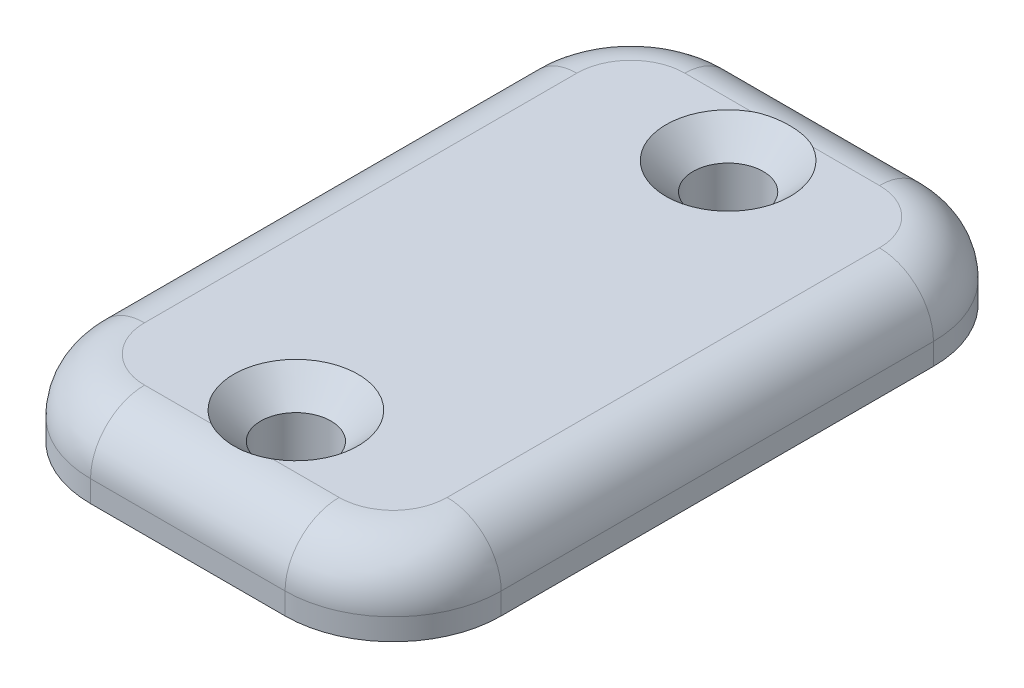
ISO-10303-21;
HEADER;
FILE_DESCRIPTION(('STEP AP214'),'2;1');
FILE_NAME('part.step','',(''),(''),'','','');
FILE_SCHEMA(('AUTOMOTIVE_DESIGN { 1 0 10303 214 1 1 1 1 }'));
ENDSEC;
DATA;
#1=APPLICATION_CONTEXT('core data for automotive mechanical design processes');
#2=APPLICATION_PROTOCOL_DEFINITION('international standard','automotive_design',2000,#1);
#3=PRODUCT_CONTEXT('',#1,'mechanical');
#4=PRODUCT('Part','Part','',(#3));
#5=PRODUCT_RELATED_PRODUCT_CATEGORY('part','',(#4));
#6=PRODUCT_DEFINITION_FORMATION('','',#4);
#7=PRODUCT_DEFINITION_CONTEXT('part definition',#1,'design');
#8=PRODUCT_DEFINITION('design','',#6,#7);
#9=PRODUCT_DEFINITION_SHAPE('','',#8);
#10=(LENGTH_UNIT() NAMED_UNIT(*) SI_UNIT(.MILLI.,.METRE.));
#11=(NAMED_UNIT(*) PLANE_ANGLE_UNIT() SI_UNIT($,.RADIAN.));
#12=(NAMED_UNIT(*) SI_UNIT($,.STERADIAN.) SOLID_ANGLE_UNIT());
#13=UNCERTAINTY_MEASURE_WITH_UNIT(LENGTH_MEASURE(1.E-05),#10,'distance_accuracy_value','');
#14=(GEOMETRIC_REPRESENTATION_CONTEXT(3) GLOBAL_UNCERTAINTY_ASSIGNED_CONTEXT((#13)) GLOBAL_UNIT_ASSIGNED_CONTEXT((#10,
#11,#12)) REPRESENTATION_CONTEXT('',''));
#15=CARTESIAN_POINT('',(0.,0.,0.));
#16=DIRECTION('',(0.,0.,1.));
#17=DIRECTION('',(1.,0.,0.));
#18=AXIS2_PLACEMENT_3D('',#15,#16,#17);
#19=CARTESIAN_POINT('',(0.,32.2,60.));
#20=DIRECTION('',(0.,1.,0.));
#21=DIRECTION('',(0.,0.,1.));
#22=AXIS2_PLACEMENT_3D('',#19,#20,#21);
#23=PLANE('',#22);
#24=CARTESIAN_POINT('',(-8.99999999999999,32.2,50.));
#25=DIRECTION('',(0.,1.,0.));
#26=DIRECTION('',(0.,0.,1.));
#27=AXIS2_PLACEMENT_3D('',#24,#25,#26);
#28=CIRCLE('',#27,5.);
#29=CARTESIAN_POINT('',(-8.99999999999999,32.2,55.));
#30=VERTEX_POINT('',#29);
#31=CARTESIAN_POINT('',(-14.,32.2,50.));
#32=VERTEX_POINT('',#31);
#33=EDGE_CURVE('E157',#30,#32,#28,.F.);
#34=ORIENTED_EDGE('',*,*,#33,.F.);
#35=DIRECTION('',(1.,0.,0.));
#36=VECTOR('',#35,1.);
#37=CARTESIAN_POINT('',(0.,32.2,55.));
#38=LINE('',#37,#36);
#39=CARTESIAN_POINT('',(-2.83945417290024,32.2,55.));
#40=VERTEX_POINT('',#39);
#41=EDGE_CURVE('E150',#30,#40,#38,.T.);
#42=ORIENTED_EDGE('',*,*,#41,.T.);
#43=CARTESIAN_POINT('',(0.,32.2,50.));
#44=DIRECTION('',(0.,1.,0.));
#45=DIRECTION('',(0.,0.,1.));
#46=AXIS2_PLACEMENT_3D('',#43,#44,#45);
#47=CIRCLE('',#46,5.75000000000005);
#48=CARTESIAN_POINT('',(2.83945417290024,32.2,55.));
#49=VERTEX_POINT('',#48);
#50=EDGE_CURVE('E152',#40,#49,#47,.F.);
#51=ORIENTED_EDGE('',*,*,#50,.T.);
#52=DIRECTION('',(1.,0.,0.));
#53=VECTOR('',#52,1.);
#54=CARTESIAN_POINT('',(0.,32.2,55.));
#55=LINE('',#54,#53);
#56=CARTESIAN_POINT('',(9.,32.2,55.));
#57=VERTEX_POINT('',#56);
#58=EDGE_CURVE('E164',#49,#57,#55,.T.);
#59=ORIENTED_EDGE('',*,*,#58,.T.);
#60=CARTESIAN_POINT('',(9.,32.2,50.));
#61=DIRECTION('',(0.,1.,0.));
#62=DIRECTION('',(0.,0.,1.));
#63=AXIS2_PLACEMENT_3D('',#60,#61,#62);
#64=CIRCLE('',#63,5.);
#65=CARTESIAN_POINT('',(14.,32.2,50.));
#66=VERTEX_POINT('',#65);
#67=EDGE_CURVE('E241',#66,#57,#64,.F.);
#68=ORIENTED_EDGE('',*,*,#67,.F.);
#69=DIRECTION('',(0.,0.,-1.));
#70=VECTOR('',#69,1.);
#71=CARTESIAN_POINT('',(14.,32.2,0.));
#72=LINE('',#71,#70);
#73=CARTESIAN_POINT('',(14.,32.2,10.));
#74=VERTEX_POINT('',#73);
#75=EDGE_CURVE('E187',#66,#74,#72,.T.);
#76=ORIENTED_EDGE('',*,*,#75,.T.);
#77=CARTESIAN_POINT('',(9.,32.2,10.));
#78=DIRECTION('',(0.,1.,0.));
#79=DIRECTION('',(0.,0.,1.));
#80=AXIS2_PLACEMENT_3D('',#77,#78,#79);
#81=CIRCLE('',#80,5.);
#82=CARTESIAN_POINT('',(9.,32.2,5.));
#83=VERTEX_POINT('',#82);
#84=EDGE_CURVE('E242',#83,#74,#81,.F.);
#85=ORIENTED_EDGE('',*,*,#84,.F.);
#86=DIRECTION('',(1.,0.,0.));
#87=VECTOR('',#86,1.);
#88=CARTESIAN_POINT('',(-19.,32.2,5.));
#89=LINE('',#88,#87);
#90=CARTESIAN_POINT('',(2.8394541729003,32.2,5.));
#91=VERTEX_POINT('',#90);
#92=EDGE_CURVE('E156',#83,#91,#89,.F.);
#93=ORIENTED_EDGE('',*,*,#92,.T.);
#94=CARTESIAN_POINT('',(0.,32.2,9.99999999999999));
#95=DIRECTION('',(0.,1.,0.));
#96=DIRECTION('',(0.,0.,1.));
#97=AXIS2_PLACEMENT_3D('',#94,#95,#96);
#98=CIRCLE('',#97,5.75000000000007);
#99=CARTESIAN_POINT('',(-2.8394541729003,32.2,5.));
#100=VERTEX_POINT('',#99);
#101=EDGE_CURVE('E175',#91,#100,#98,.F.);
#102=ORIENTED_EDGE('',*,*,#101,.T.);
#103=DIRECTION('',(1.,0.,0.));
#104=VECTOR('',#103,1.);
#105=CARTESIAN_POINT('',(-19.,32.2,5.));
#106=LINE('',#105,#104);
#107=CARTESIAN_POINT('',(-8.99999999999999,32.2,5.));
#108=VERTEX_POINT('',#107);
#109=EDGE_CURVE('E158',#100,#108,#106,.F.);
#110=ORIENTED_EDGE('',*,*,#109,.T.);
#111=CARTESIAN_POINT('',(-8.99999999999999,32.2,10.));
#112=DIRECTION('',(0.,1.,0.));
#113=DIRECTION('',(0.,0.,1.));
#114=AXIS2_PLACEMENT_3D('',#111,#112,#113);
#115=CIRCLE('',#114,5.);
#116=CARTESIAN_POINT('',(-14.,32.2,10.));
#117=VERTEX_POINT('',#116);
#118=EDGE_CURVE('E250',#117,#108,#115,.F.);
#119=ORIENTED_EDGE('',*,*,#118,.F.);
#120=DIRECTION('',(0.,0.,-1.));
#121=VECTOR('',#120,1.);
#122=CARTESIAN_POINT('',(-14.,32.2,60.));
#123=LINE('',#122,#121);
#124=EDGE_CURVE('E174',#117,#32,#123,.F.);
#125=ORIENTED_EDGE('',*,*,#124,.T.);
#126=EDGE_LOOP('',(#34,#42,#51,#59,#68,#76,#85,#93,#102,#110,#119,#125));
#127=FACE_BOUND('',#126,.T.);
#128=ADVANCED_FACE('F44',(#127),#23,.T.);
#129=CARTESIAN_POINT('',(0.,29.6999999999999,9.99999999999999));
#130=DIRECTION('',(0.,1.,0.));
#131=DIRECTION('',(0.,0.,1.));
#132=AXIS2_PLACEMENT_3D('',#129,#130,#131);
#133=CONICAL_SURFACE('',#132,3.25,0.78539816339745);
#134=ORIENTED_EDGE('',*,*,#101,.F.);
#135=CARTESIAN_POINT('',(2.8394541729003,32.2,5.));
#136=CARTESIAN_POINT('',(2.77701180748167,32.1999967904525,4.96454306186633));
#137=CARTESIAN_POINT('',(2.71373734153912,32.199623182009,4.93058687727614));
#138=CARTESIAN_POINT('',(2.5857312783847,32.1982995553661,4.86559718841058));
#139=CARTESIAN_POINT('',(2.52100009169975,32.1973496976519,4.83456287317575));
#140=CARTESIAN_POINT('',(2.32506969512298,32.1938851873325,4.74578266282135));
#141=CARTESIAN_POINT('',(2.19195042263589,32.1907546285525,4.69225661805047));
#142=CARTESIAN_POINT('',(1.92273144178334,32.1838988726502,4.59620443111456));
#143=CARTESIAN_POINT('',(1.78665337530315,32.1801772126099,4.55361657202852));
#144=CARTESIAN_POINT('',(1.51168559547504,32.1728773065376,4.47854782318284));
#145=CARTESIAN_POINT('',(1.37279478485586,32.1692991181624,4.44607096195946));
#146=CARTESIAN_POINT('',(1.08771237446433,32.1627147179003,4.38984041579236));
#147=CARTESIAN_POINT('',(0.941445042299288,32.1597356995484,4.36646897233116));
#148=CARTESIAN_POINT('',(0.647613833704594,32.1549410782678,4.33000335570781));
#149=CARTESIAN_POINT('',(0.500049874684837,32.1531255500016,4.31690984207926));
#150=CARTESIAN_POINT('',(0.203776272793809,32.1508806955571,4.30082379596564));
#151=CARTESIAN_POINT('',(0.0550644070275619,32.150456885622,4.29787145712705));
#152=CARTESIAN_POINT('',(-0.242215005936862,32.151060759135,4.30214699650085));
#153=CARTESIAN_POINT('',(-0.390782542221276,32.1520885449169,4.30937559244355));
#154=CARTESIAN_POINT('',(-0.717900880967203,32.1558281196479,4.33666748261943));
#155=CARTESIAN_POINT('',(-0.896257482571835,32.1588458372464,4.35908861127944));
#156=CARTESIAN_POINT('',(-1.25043701333155,32.1662564059591,4.4192954615815));
#157=CARTESIAN_POINT('',(-1.42625864428835,32.1706499371914,4.45708878506348));
#158=CARTESIAN_POINT('',(-1.77286026127886,32.1797803822724,4.54845836980744));
#159=CARTESIAN_POINT('',(-1.94366035622819,32.1845155512584,4.6019581948921));
#160=CARTESIAN_POINT('',(-2.27900387951099,32.1928557866749,4.72568687593271));
#161=CARTESIAN_POINT('',(-2.44355536329236,32.1964623547406,4.79589328233448));
#162=CARTESIAN_POINT('',(-2.64352579762328,32.1989294159071,4.89471398219272));
#163=CARTESIAN_POINT('',(-2.6831370167109,32.1993202222608,4.91497879807455));
#164=CARTESIAN_POINT('',(-2.76175686875064,32.1998556133103,4.95663655904585));
#165=CARTESIAN_POINT('',(-2.80076557570586,32.2000002284864,4.97802936414313));
#166=CARTESIAN_POINT('',(-2.8394541729003,32.2,5.));
#167=B_SPLINE_CURVE_WITH_KNOTS('',3,(#135,#136,#137,#138,#139,#140,#141,#142,#143,#144,#145,
#146,#147,#148,#149,#150,#151,#152,#153,#154,#155,#156,#157,#158,#159,#160,#161,#162,#163,#164,
#165,#166),.UNSPECIFIED.,.F.,.F.,(4,2,2,2,2,2,2,2,2,2,2,2,2,2,2,4),(0.,0.215370011368553,
0.430680069876265,0.860672050618723,1.28818175499743,1.71586157520339,2.15994075109805,
2.60404842117403,3.04991425426598,3.49581152135144,4.03449876041674,4.57345271497647,
5.10982612256911,5.6454828056678,5.77895636905964,5.91241340616258),.UNSPECIFIED.);
#168=EDGE_CURVE('E223',#91,#100,#167,.T.);
#169=ORIENTED_EDGE('',*,*,#168,.T.);
#170=EDGE_LOOP('',(#134,#169));
#171=FACE_BOUND('',#170,.T.);
#172=CARTESIAN_POINT('',(0.,29.6999999999999,9.99999999999999));
#173=DIRECTION('',(0.,1.,0.));
#174=DIRECTION('',(0.,0.,1.));
#175=AXIS2_PLACEMENT_3D('',#172,#173,#174);
#176=CIRCLE('',#175,3.25);
#177=CARTESIAN_POINT('',(0.,29.6999999999999,13.25));
#178=VERTEX_POINT('',#177);
#179=EDGE_CURVE('E171',#178,#178,#176,.T.);
#180=ORIENTED_EDGE('',*,*,#179,.F.);
#181=EDGE_LOOP('',(#180));
#182=FACE_BOUND('',#181,.T.);
#183=ADVANCED_FACE('F210',(#171,#182),#133,.F.);
#184=CARTESIAN_POINT('',(0.,29.6999999999999,50.));
#185=DIRECTION('',(0.,1.,0.));
#186=DIRECTION('',(0.,0.,1.));
#187=AXIS2_PLACEMENT_3D('',#184,#185,#186);
#188=CONICAL_SURFACE('',#187,3.25,0.785398163397449);
#189=ORIENTED_EDGE('',*,*,#50,.F.);
#190=CARTESIAN_POINT('',(-2.83945417290024,32.2,55.));
#191=CARTESIAN_POINT('',(-2.77701180748161,32.1999967904525,55.0354569381337));
#192=CARTESIAN_POINT('',(-2.71373734153906,32.199623182009,55.0694131227239));
#193=CARTESIAN_POINT('',(-2.58573127838464,32.1982995553661,55.1344028115894));
#194=CARTESIAN_POINT('',(-2.52100009169968,32.1973496976519,55.1654371268243));
#195=CARTESIAN_POINT('',(-2.32506969512292,32.1938851873325,55.2542173371786));
#196=CARTESIAN_POINT('',(-2.19195042263582,32.1907546285525,55.3077433819495));
#197=CARTESIAN_POINT('',(-1.92273144178327,32.1838988726502,55.4037955688854));
#198=CARTESIAN_POINT('',(-1.78665337530309,32.1801772126099,55.4463834279715));
#199=CARTESIAN_POINT('',(-1.51168559547498,32.1728773065376,55.5214521768171));
#200=CARTESIAN_POINT('',(-1.3727947848558,32.1692991181624,55.5539290380405));
#201=CARTESIAN_POINT('',(-1.08771237446427,32.1627147179003,55.6101595842076));
#202=CARTESIAN_POINT('',(-0.94144504229923,32.1597356995484,55.6335310276688));
#203=CARTESIAN_POINT('',(-0.647613833704536,32.1549410782678,55.6699966442922));
#204=CARTESIAN_POINT('',(-0.500049874684779,32.1531255500016,55.6830901579207));
#205=CARTESIAN_POINT('',(-0.203776272793751,32.1508806955571,55.6991762040343));
#206=CARTESIAN_POINT('',(-0.055064407027504,32.150456885622,55.7021285428729));
#207=CARTESIAN_POINT('',(0.242215005936919,32.151060759135,55.6978530034991));
#208=CARTESIAN_POINT('',(0.390782542221334,32.1520885449169,55.6906244075564));
#209=CARTESIAN_POINT('',(0.717900880967258,32.1558281196479,55.6633325173805));
#210=CARTESIAN_POINT('',(0.896257482571889,32.1588458372464,55.6409113887205));
#211=CARTESIAN_POINT('',(1.2504370133316,32.1662564059591,55.5807045384185));
#212=CARTESIAN_POINT('',(1.4262586442884,32.1706499371914,55.5429112149365));
#213=CARTESIAN_POINT('',(1.7728602612789,32.1797803822724,55.4515416301925));
#214=CARTESIAN_POINT('',(1.94366035622823,32.1845155512584,55.3980418051079));
#215=CARTESIAN_POINT('',(2.27900387951103,32.1928557866749,55.2743131240672));
#216=CARTESIAN_POINT('',(2.4435553632924,32.1964623547406,55.2041067176655));
#217=CARTESIAN_POINT('',(2.6435257976233,32.1989294159071,55.1052860178072));
#218=CARTESIAN_POINT('',(2.68313701671091,32.1993202222608,55.0850212019254));
#219=CARTESIAN_POINT('',(2.76175686875061,32.1998556133103,55.0433634409541));
#220=CARTESIAN_POINT('',(2.80076557570582,32.2000002284864,55.0219706358569));
#221=CARTESIAN_POINT('',(2.83945417290023,32.2,55.));
#222=B_SPLINE_CURVE_WITH_KNOTS('',3,(#190,#191,#192,#193,#194,#195,#196,#197,#198,#199,#200,
#201,#202,#203,#204,#205,#206,#207,#208,#209,#210,#211,#212,#213,#214,#215,#216,#217,#218,#219,
#220,#221),.UNSPECIFIED.,.F.,.F.,(4,2,2,2,2,2,2,2,2,2,2,2,2,2,2,4),(0.,0.215370011368553,
0.43068006987627,0.860672050618723,1.28818175499742,1.71586157520338,2.15994075109804,
2.60404842117402,3.04991425426597,3.49581152135143,4.03449876041673,4.57345271497646,
5.10982612256909,5.64548280566778,5.77895636905956,5.91241340616245),.UNSPECIFIED.);
#223=EDGE_CURVE('E162',#40,#49,#222,.T.);
#224=ORIENTED_EDGE('',*,*,#223,.T.);
#225=EDGE_LOOP('',(#189,#224));
#226=FACE_BOUND('',#225,.T.);
#227=CARTESIAN_POINT('',(0.,29.6999999999999,50.));
#228=DIRECTION('',(0.,1.,0.));
#229=DIRECTION('',(0.,0.,1.));
#230=AXIS2_PLACEMENT_3D('',#227,#228,#229);
#231=CIRCLE('',#230,3.25);
#232=CARTESIAN_POINT('',(0.,29.6999999999999,53.25));
#233=VERTEX_POINT('',#232);
#234=EDGE_CURVE('E178',#233,#233,#231,.T.);
#235=ORIENTED_EDGE('',*,*,#234,.F.);
#236=EDGE_LOOP('',(#235));
#237=FACE_BOUND('',#236,.T.);
#238=ADVANCED_FACE('F169',(#226,#237),#188,.F.);
#239=CARTESIAN_POINT('',(0.,-19.,9.99999999999999));
#240=DIRECTION('',(0.,1.,0.));
#241=DIRECTION('',(0.,0.,1.));
#242=AXIS2_PLACEMENT_3D('',#239,#240,#241);
#243=CYLINDRICAL_SURFACE('',#242,3.25);
#244=CARTESIAN_POINT('',(0.,25.2,9.99999999999999));
#245=DIRECTION('',(0.,-1.,0.));
#246=DIRECTION('',(1.,0.,0.));
#247=AXIS2_PLACEMENT_3D('',#244,#245,#246);
#248=CIRCLE('',#247,3.25);
#249=CARTESIAN_POINT('',(0.,25.2,13.25));
#250=VERTEX_POINT('',#249);
#251=EDGE_CURVE('E314',#250,#250,#248,.T.);
#252=CARTESIAN_POINT('',(0.,29.6999999999999,13.25));
#253=CARTESIAN_POINT('',(0.,29.6531249999999,13.25));
#254=CARTESIAN_POINT('',(0.,29.6062499999999,13.25));
#255=CARTESIAN_POINT('',(0.,29.5124999999999,13.25));
#256=CARTESIAN_POINT('',(0.,29.4656249999999,13.25));
#257=CARTESIAN_POINT('',(0.,29.3718749999999,13.25));
#258=CARTESIAN_POINT('',(0.,29.3249999999999,13.25));
#259=CARTESIAN_POINT('',(0.,29.2312499999999,13.25));
#260=CARTESIAN_POINT('',(0.,29.1843749999999,13.25));
#261=CARTESIAN_POINT('',(0.,29.0906249999999,13.25));
#262=CARTESIAN_POINT('',(0.,29.0437499999999,13.25));
#263=CARTESIAN_POINT('',(0.,28.9499999999999,13.25));
#264=CARTESIAN_POINT('',(0.,28.9031249999999,13.25));
#265=CARTESIAN_POINT('',(0.,28.8093749999999,13.25));
#266=CARTESIAN_POINT('',(0.,28.7624999999999,13.25));
#267=CARTESIAN_POINT('',(0.,28.6687499999999,13.25));
#268=CARTESIAN_POINT('',(0.,28.6218749999999,13.25));
#269=CARTESIAN_POINT('',(0.,28.5281249999999,13.25));
#270=CARTESIAN_POINT('',(0.,28.4812499999999,13.25));
#271=CARTESIAN_POINT('',(0.,28.3874999999999,13.25));
#272=CARTESIAN_POINT('',(0.,28.3406249999999,13.25));
#273=CARTESIAN_POINT('',(0.,28.246875,13.25));
#274=CARTESIAN_POINT('',(0.,28.1999999999999,13.25));
#275=CARTESIAN_POINT('',(0.,28.10625,13.25));
#276=CARTESIAN_POINT('',(0.,28.059375,13.25));
#277=CARTESIAN_POINT('',(0.,27.965625,13.25));
#278=CARTESIAN_POINT('',(0.,27.91875,13.25));
#279=CARTESIAN_POINT('',(0.,27.825,13.25));
#280=CARTESIAN_POINT('',(0.,27.778125,13.25));
#281=CARTESIAN_POINT('',(0.,27.684375,13.25));
#282=CARTESIAN_POINT('',(0.,27.6375,13.25));
#283=CARTESIAN_POINT('',(0.,27.54375,13.25));
#284=CARTESIAN_POINT('',(0.,27.496875,13.25));
#285=CARTESIAN_POINT('',(0.,27.403125,13.25));
#286=CARTESIAN_POINT('',(0.,27.35625,13.25));
#287=CARTESIAN_POINT('',(0.,27.2625,13.25));
#288=CARTESIAN_POINT('',(0.,27.215625,13.25));
#289=CARTESIAN_POINT('',(0.,27.121875,13.25));
#290=CARTESIAN_POINT('',(0.,27.075,13.25));
#291=CARTESIAN_POINT('',(0.,26.98125,13.25));
#292=CARTESIAN_POINT('',(0.,26.934375,13.25));
#293=CARTESIAN_POINT('',(0.,26.840625,13.25));
#294=CARTESIAN_POINT('',(0.,26.79375,13.25));
#295=CARTESIAN_POINT('',(0.,26.7,13.25));
#296=CARTESIAN_POINT('',(0.,26.653125,13.25));
#297=CARTESIAN_POINT('',(0.,26.559375,13.25));
#298=CARTESIAN_POINT('',(0.,26.5125,13.25));
#299=CARTESIAN_POINT('',(0.,26.41875,13.25));
#300=CARTESIAN_POINT('',(0.,26.371875,13.25));
#301=CARTESIAN_POINT('',(0.,26.278125,13.25));
#302=CARTESIAN_POINT('',(0.,26.23125,13.25));
#303=CARTESIAN_POINT('',(0.,26.1375,13.25));
#304=CARTESIAN_POINT('',(0.,26.090625,13.25));
#305=CARTESIAN_POINT('',(0.,25.996875,13.25));
#306=CARTESIAN_POINT('',(0.,25.95,13.25));
#307=CARTESIAN_POINT('',(0.,25.85625,13.25));
#308=CARTESIAN_POINT('',(0.,25.809375,13.25));
#309=CARTESIAN_POINT('',(0.,25.715625,13.25));
#310=CARTESIAN_POINT('',(0.,25.66875,13.25));
#311=CARTESIAN_POINT('',(0.,25.575,13.25));
#312=CARTESIAN_POINT('',(0.,25.528125,13.25));
#313=CARTESIAN_POINT('',(0.,25.434375,13.25));
#314=CARTESIAN_POINT('',(0.,25.3875,13.25));
#315=CARTESIAN_POINT('',(0.,25.29375,13.25));
#316=CARTESIAN_POINT('',(0.,25.246875,13.25));
#317=CARTESIAN_POINT('',(0.,25.2,13.25));
#318=B_SPLINE_CURVE_WITH_KNOTS('',3,(#252,#253,#254,#255,#256,#257,#258,#259,#260,#261,#262,
#263,#264,#265,#266,#267,#268,#269,#270,#271,#272,#273,#274,#275,#276,#277,#278,#279,#280,#281,
#282,#283,#284,#285,#286,#287,#288,#289,#290,#291,#292,#293,#294,#295,#296,#297,#298,#299,#300,
#301,#302,#303,#304,#305,#306,#307,#308,#309,#310,#311,#312,#313,#314,#315,#316,#317),
.UNSPECIFIED.,.F.,.F.,(4,2,2,2,2,2,2,2,2,2,2,2,2,2,2,2,2,2,2,2,2,2,2,2,2,2,2,2,2,2,2,2,4),(0.,
0.140624999999998,0.281249999999997,0.421874999999995,0.562499999999994,0.703124999999985,
0.843749999999983,0.984374999999982,1.12499999999998,1.26562499999998,1.40624999999998,
1.54687499999998,1.68749999999997,1.82812499999997,1.96874999999996,2.10937499999996,
2.24999999999996,2.39062499999996,2.53124999999996,2.67187499999996,2.81249999999995,
2.95312499999995,3.09374999999994,3.23437499999994,3.37499999999994,3.51562499999994,
3.65624999999994,3.79687499999994,3.93749999999993,4.07812499999993,4.21874999999992,
4.35937499999992,4.49999999999992),.UNSPECIFIED.);
#319=EDGE_CURVE('BSEAM331',#178,#250,#318,.T.);
#320=ORIENTED_EDGE('',*,*,#179,.T.);
#321=ORIENTED_EDGE('',*,*,#251,.T.);
#322=ORIENTED_EDGE('',*,*,#319,.T.);
#323=ORIENTED_EDGE('',*,*,#319,.F.);
#324=EDGE_LOOP('',(#320,#322,#321,#323));
#325=FACE_BOUND('',#324,.T.);
#326=ADVANCED_FACE('F331',(#325),#243,.F.);
#327=CARTESIAN_POINT('',(0.,-19.,50.));
#328=DIRECTION('',(0.,1.,0.));
#329=DIRECTION('',(0.,0.,1.));
#330=AXIS2_PLACEMENT_3D('',#327,#328,#329);
#331=CYLINDRICAL_SURFACE('',#330,3.25);
#332=CARTESIAN_POINT('',(0.,25.2,50.));
#333=DIRECTION('',(0.,-1.,0.));
#334=DIRECTION('',(1.,0.,0.));
#335=AXIS2_PLACEMENT_3D('',#332,#333,#334);
#336=CIRCLE('',#335,3.25);
#337=CARTESIAN_POINT('',(0.,25.2,53.25));
#338=VERTEX_POINT('',#337);
#339=EDGE_CURVE('E319',#338,#338,#336,.T.);
#340=CARTESIAN_POINT('',(0.,29.6999999999999,53.25));
#341=CARTESIAN_POINT('',(0.,29.6531249999999,53.25));
#342=CARTESIAN_POINT('',(0.,29.6062499999999,53.25));
#343=CARTESIAN_POINT('',(0.,29.5124999999999,53.25));
#344=CARTESIAN_POINT('',(0.,29.4656249999999,53.25));
#345=CARTESIAN_POINT('',(0.,29.3718749999999,53.25));
#346=CARTESIAN_POINT('',(0.,29.3249999999999,53.25));
#347=CARTESIAN_POINT('',(0.,29.2312499999999,53.25));
#348=CARTESIAN_POINT('',(0.,29.1843749999999,53.25));
#349=CARTESIAN_POINT('',(0.,29.0906249999999,53.25));
#350=CARTESIAN_POINT('',(0.,29.0437499999999,53.25));
#351=CARTESIAN_POINT('',(0.,28.95,53.25));
#352=CARTESIAN_POINT('',(0.,28.9031249999999,53.25));
#353=CARTESIAN_POINT('',(0.,28.809375,53.25));
#354=CARTESIAN_POINT('',(0.,28.7624999999999,53.25));
#355=CARTESIAN_POINT('',(0.,28.66875,53.25));
#356=CARTESIAN_POINT('',(0.,28.621875,53.25));
#357=CARTESIAN_POINT('',(0.,28.528125,53.25));
#358=CARTESIAN_POINT('',(0.,28.48125,53.25));
#359=CARTESIAN_POINT('',(0.,28.3875,53.25));
#360=CARTESIAN_POINT('',(0.,28.340625,53.25));
#361=CARTESIAN_POINT('',(0.,28.246875,53.25));
#362=CARTESIAN_POINT('',(0.,28.2,53.25));
#363=CARTESIAN_POINT('',(0.,28.10625,53.25));
#364=CARTESIAN_POINT('',(0.,28.059375,53.25));
#365=CARTESIAN_POINT('',(0.,27.965625,53.25));
#366=CARTESIAN_POINT('',(0.,27.91875,53.25));
#367=CARTESIAN_POINT('',(0.,27.825,53.25));
#368=CARTESIAN_POINT('',(0.,27.778125,53.25));
#369=CARTESIAN_POINT('',(0.,27.684375,53.25));
#370=CARTESIAN_POINT('',(0.,27.6375,53.25));
#371=CARTESIAN_POINT('',(0.,27.54375,53.25));
#372=CARTESIAN_POINT('',(0.,27.496875,53.25));
#373=CARTESIAN_POINT('',(0.,27.403125,53.25));
#374=CARTESIAN_POINT('',(0.,27.35625,53.25));
#375=CARTESIAN_POINT('',(0.,27.2625,53.25));
#376=CARTESIAN_POINT('',(0.,27.215625,53.25));
#377=CARTESIAN_POINT('',(0.,27.121875,53.25));
#378=CARTESIAN_POINT('',(0.,27.075,53.25));
#379=CARTESIAN_POINT('',(0.,26.98125,53.25));
#380=CARTESIAN_POINT('',(0.,26.934375,53.25));
#381=CARTESIAN_POINT('',(0.,26.840625,53.25));
#382=CARTESIAN_POINT('',(0.,26.79375,53.25));
#383=CARTESIAN_POINT('',(0.,26.7,53.25));
#384=CARTESIAN_POINT('',(0.,26.653125,53.25));
#385=CARTESIAN_POINT('',(0.,26.559375,53.25));
#386=CARTESIAN_POINT('',(0.,26.5125,53.25));
#387=CARTESIAN_POINT('',(0.,26.41875,53.25));
#388=CARTESIAN_POINT('',(0.,26.371875,53.25));
#389=CARTESIAN_POINT('',(0.,26.278125,53.25));
#390=CARTESIAN_POINT('',(0.,26.23125,53.25));
#391=CARTESIAN_POINT('',(0.,26.1375,53.25));
#392=CARTESIAN_POINT('',(0.,26.090625,53.25));
#393=CARTESIAN_POINT('',(0.,25.996875,53.25));
#394=CARTESIAN_POINT('',(0.,25.95,53.25));
#395=CARTESIAN_POINT('',(0.,25.85625,53.25));
#396=CARTESIAN_POINT('',(0.,25.809375,53.25));
#397=CARTESIAN_POINT('',(0.,25.715625,53.25));
#398=CARTESIAN_POINT('',(0.,25.66875,53.25));
#399=CARTESIAN_POINT('',(0.,25.575,53.25));
#400=CARTESIAN_POINT('',(0.,25.528125,53.25));
#401=CARTESIAN_POINT('',(0.,25.434375,53.25));
#402=CARTESIAN_POINT('',(0.,25.3875,53.25));
#403=CARTESIAN_POINT('',(0.,25.29375,53.25));
#404=CARTESIAN_POINT('',(0.,25.246875,53.25));
#405=CARTESIAN_POINT('',(0.,25.2,53.25));
#406=B_SPLINE_CURVE_WITH_KNOTS('',3,(#340,#341,#342,#343,#344,#345,#346,#347,#348,#349,#350,
#351,#352,#353,#354,#355,#356,#357,#358,#359,#360,#361,#362,#363,#364,#365,#366,#367,#368,#369,
#370,#371,#372,#373,#374,#375,#376,#377,#378,#379,#380,#381,#382,#383,#384,#385,#386,#387,#388,
#389,#390,#391,#392,#393,#394,#395,#396,#397,#398,#399,#400,#401,#402,#403,#404,#405),
.UNSPECIFIED.,.F.,.F.,(4,2,2,2,2,2,2,2,2,2,2,2,2,2,2,2,2,2,2,2,2,2,2,2,2,2,2,2,2,2,2,2,4),(0.,
0.140624999999998,0.281249999999997,0.421874999999995,0.562499999999994,0.703124999999992,
0.84374999999999,0.984374999999989,1.12499999999999,1.26562499999998,1.40624999999998,
1.54687499999998,1.68749999999997,1.82812499999997,1.96874999999997,2.10937499999997,
2.24999999999997,2.39062499999997,2.53124999999996,2.67187499999996,2.81249999999996,
2.95312499999996,3.09374999999996,3.23437499999996,3.37499999999995,3.51562499999995,
3.65624999999994,3.79687499999994,3.93749999999994,4.07812499999994,4.21874999999994,
4.35937499999994,4.49999999999993),.UNSPECIFIED.);
#407=EDGE_CURVE('BSEAM332',#233,#338,#406,.T.);
#408=ORIENTED_EDGE('',*,*,#234,.T.);
#409=ORIENTED_EDGE('',*,*,#339,.T.);
#410=ORIENTED_EDGE('',*,*,#407,.T.);
#411=ORIENTED_EDGE('',*,*,#407,.F.);
#412=EDGE_LOOP('',(#408,#410,#409,#411));
#413=FACE_BOUND('',#412,.T.);
#414=ADVANCED_FACE('F332',(#413),#331,.F.);
#415=CARTESIAN_POINT('',(-19.,0.,60.));
#416=DIRECTION('',(1.,0.,0.));
#417=DIRECTION('',(0.,1.,0.));
#418=AXIS2_PLACEMENT_3D('',#415,#416,#417);
#419=PLANE('',#418);
#420=DIRECTION('',(0.,0.,-1.));
#421=VECTOR('',#420,1.);
#422=CARTESIAN_POINT('',(-19.,27.2,0.));
#423=LINE('',#422,#421);
#424=CARTESIAN_POINT('',(-19.,27.2,50.));
#425=VERTEX_POINT('',#424);
#426=CARTESIAN_POINT('',(-19.,27.2,10.));
#427=VERTEX_POINT('',#426);
#428=EDGE_CURVE('E235',#425,#427,#423,.T.);
#429=ORIENTED_EDGE('',*,*,#428,.T.);
#430=DIRECTION('',(0.,-1.,0.));
#431=VECTOR('',#430,1.);
#432=CARTESIAN_POINT('',(-19.,0.,10.));
#433=LINE('',#432,#431);
#434=CARTESIAN_POINT('',(-19.,25.2,10.));
#435=VERTEX_POINT('',#434);
#436=EDGE_CURVE('E11',#427,#435,#433,.T.);
#437=ORIENTED_EDGE('',*,*,#436,.T.);
#438=DIRECTION('',(0.,0.,-1.));
#439=VECTOR('',#438,1.);
#440=CARTESIAN_POINT('',(-19.,25.2,60.));
#441=LINE('',#440,#439);
#442=CARTESIAN_POINT('',(-19.,25.2,50.));
#443=VERTEX_POINT('',#442);
#444=EDGE_CURVE('E326',#443,#435,#441,.T.);
#445=ORIENTED_EDGE('',*,*,#444,.F.);
#446=DIRECTION('',(0.,-1.,0.));
#447=VECTOR('',#446,1.);
#448=CARTESIAN_POINT('',(-19.,27.2,50.));
#449=LINE('',#448,#447);
#450=EDGE_CURVE('E53',#443,#425,#449,.F.);
#451=ORIENTED_EDGE('',*,*,#450,.T.);
#452=EDGE_LOOP('',(#429,#437,#445,#451));
#453=FACE_BOUND('',#452,.T.);
#454=ADVANCED_FACE('F350',(#453),#419,.F.);
#455=CARTESIAN_POINT('',(0.,25.2,60.));
#456=DIRECTION('',(0.,-1.,0.));
#457=DIRECTION('',(1.,0.,0.));
#458=AXIS2_PLACEMENT_3D('',#455,#456,#457);
#459=PLANE('',#458);
#460=DIRECTION('',(0.,0.,-1.));
#461=VECTOR('',#460,1.);
#462=CARTESIAN_POINT('',(19.,25.2,60.));
#463=LINE('',#462,#461);
#464=CARTESIAN_POINT('',(19.,25.2,50.));
#465=VERTEX_POINT('',#464);
#466=CARTESIAN_POINT('',(19.,25.2,10.));
#467=VERTEX_POINT('',#466);
#468=EDGE_CURVE('E284',#465,#467,#463,.T.);
#469=ORIENTED_EDGE('',*,*,#468,.F.);
#470=CARTESIAN_POINT('',(9.,25.2,50.));
#471=DIRECTION('',(0.,-1.,0.));
#472=DIRECTION('',(1.,0.,0.));
#473=AXIS2_PLACEMENT_3D('',#470,#471,#472);
#474=CIRCLE('',#473,10.);
#475=CARTESIAN_POINT('',(9.,25.2,60.));
#476=VERTEX_POINT('',#475);
#477=EDGE_CURVE('E278',#465,#476,#474,.T.);
#478=ORIENTED_EDGE('',*,*,#477,.T.);
#479=DIRECTION('',(-1.,0.,0.));
#480=VECTOR('',#479,1.);
#481=CARTESIAN_POINT('',(0.,25.2,60.));
#482=LINE('',#481,#480);
#483=CARTESIAN_POINT('',(-8.99999999999999,25.2,60.));
#484=VERTEX_POINT('',#483);
#485=EDGE_CURVE('E325',#476,#484,#482,.T.);
#486=ORIENTED_EDGE('',*,*,#485,.T.);
#487=CARTESIAN_POINT('',(-8.99999999999999,25.2,50.));
#488=DIRECTION('',(0.,-1.,0.));
#489=DIRECTION('',(1.,0.,0.));
#490=AXIS2_PLACEMENT_3D('',#487,#488,#489);
#491=CIRCLE('',#490,10.);
#492=EDGE_CURVE('E272',#484,#443,#491,.T.);
#493=ORIENTED_EDGE('',*,*,#492,.T.);
#494=ORIENTED_EDGE('',*,*,#444,.T.);
#495=CARTESIAN_POINT('',(-8.99999999999999,25.2,10.));
#496=DIRECTION('',(0.,-1.,0.));
#497=DIRECTION('',(1.,0.,0.));
#498=AXIS2_PLACEMENT_3D('',#495,#496,#497);
#499=CIRCLE('',#498,10.);
#500=CARTESIAN_POINT('',(-8.99999999999999,25.2,0.));
#501=VERTEX_POINT('',#500);
#502=EDGE_CURVE('E64',#435,#501,#499,.T.);
#503=ORIENTED_EDGE('',*,*,#502,.T.);
#504=DIRECTION('',(-1.,0.,0.));
#505=VECTOR('',#504,1.);
#506=CARTESIAN_POINT('',(0.,25.2,0.));
#507=LINE('',#506,#505);
#508=CARTESIAN_POINT('',(9.,25.2,0.));
#509=VERTEX_POINT('',#508);
#510=EDGE_CURVE('E322',#509,#501,#507,.T.);
#511=ORIENTED_EDGE('',*,*,#510,.F.);
#512=CARTESIAN_POINT('',(9.,25.2,10.));
#513=DIRECTION('',(0.,-1.,0.));
#514=DIRECTION('',(1.,0.,0.));
#515=AXIS2_PLACEMENT_3D('',#512,#513,#514);
#516=CIRCLE('',#515,10.);
#517=EDGE_CURVE('E274',#509,#467,#516,.T.);
#518=ORIENTED_EDGE('',*,*,#517,.T.);
#519=EDGE_LOOP('',(#469,#478,#486,#493,#494,#503,#511,#518));
#520=FACE_BOUND('',#519,.T.);
#521=ORIENTED_EDGE('',*,*,#339,.F.);
#522=EDGE_LOOP('',(#521));
#523=FACE_BOUND('',#522,.T.);
#524=ORIENTED_EDGE('',*,*,#251,.F.);
#525=EDGE_LOOP('',(#524));
#526=FACE_BOUND('',#525,.T.);
#527=ADVANCED_FACE('F309',(#520,#523,#526),#459,.T.);
#528=CARTESIAN_POINT('',(0.,0.,0.));
#529=DIRECTION('',(0.,0.,1.));
#530=DIRECTION('',(1.,0.,0.));
#531=AXIS2_PLACEMENT_3D('',#528,#529,#530);
#532=PLANE('',#531);
#533=DIRECTION('',(1.,0.,0.));
#534=VECTOR('',#533,1.);
#535=CARTESIAN_POINT('',(19.,27.2,0.));
#536=LINE('',#535,#534);
#537=CARTESIAN_POINT('',(-8.99999999999999,27.2,0.));
#538=VERTEX_POINT('',#537);
#539=CARTESIAN_POINT('',(9.,27.2,0.));
#540=VERTEX_POINT('',#539);
#541=EDGE_CURVE('E231',#538,#540,#536,.T.);
#542=ORIENTED_EDGE('',*,*,#541,.T.);
#543=DIRECTION('',(0.,1.,0.));
#544=VECTOR('',#543,1.);
#545=CARTESIAN_POINT('',(9.,0.,0.));
#546=LINE('',#545,#544);
#547=EDGE_CURVE('E68',#540,#509,#546,.F.);
#548=ORIENTED_EDGE('',*,*,#547,.T.);
#549=ORIENTED_EDGE('',*,*,#510,.T.);
#550=DIRECTION('',(0.,-1.,0.));
#551=VECTOR('',#550,1.);
#552=CARTESIAN_POINT('',(-8.99999999999998,0.,0.));
#553=LINE('',#552,#551);
#554=EDGE_CURVE('E277',#501,#538,#553,.F.);
#555=ORIENTED_EDGE('',*,*,#554,.T.);
#556=EDGE_LOOP('',(#542,#548,#549,#555));
#557=FACE_BOUND('',#556,.T.);
#558=ADVANCED_FACE('F354',(#557),#532,.F.);
#559=CARTESIAN_POINT('',(0.,0.,60.));
#560=DIRECTION('',(0.,0.,1.));
#561=DIRECTION('',(1.,0.,0.));
#562=AXIS2_PLACEMENT_3D('',#559,#560,#561);
#563=PLANE('',#562);
#564=ORIENTED_EDGE('',*,*,#485,.F.);
#565=DIRECTION('',(0.,1.,0.));
#566=VECTOR('',#565,1.);
#567=CARTESIAN_POINT('',(9.,27.2,60.));
#568=LINE('',#567,#566);
#569=CARTESIAN_POINT('',(9.,27.2,60.));
#570=VERTEX_POINT('',#569);
#571=EDGE_CURVE('E264',#476,#570,#568,.T.);
#572=ORIENTED_EDGE('',*,*,#571,.T.);
#573=DIRECTION('',(1.,0.,0.));
#574=VECTOR('',#573,1.);
#575=CARTESIAN_POINT('',(0.,27.2,60.));
#576=LINE('',#575,#574);
#577=CARTESIAN_POINT('',(-8.99999999999999,27.2,60.));
#578=VERTEX_POINT('',#577);
#579=EDGE_CURVE('E170',#570,#578,#576,.F.);
#580=ORIENTED_EDGE('',*,*,#579,.T.);
#581=DIRECTION('',(0.,-1.,0.));
#582=VECTOR('',#581,1.);
#583=CARTESIAN_POINT('',(-8.99999999999999,25.2,60.));
#584=LINE('',#583,#582);
#585=EDGE_CURVE('E262',#578,#484,#584,.T.);
#586=ORIENTED_EDGE('',*,*,#585,.T.);
#587=EDGE_LOOP('',(#564,#572,#580,#586));
#588=FACE_BOUND('',#587,.T.);
#589=ADVANCED_FACE('F353',(#588),#563,.T.);
#590=CARTESIAN_POINT('',(19.,-19.,60.));
#591=DIRECTION('',(-1.,0.,0.));
#592=DIRECTION('',(0.,0.,1.));
#593=AXIS2_PLACEMENT_3D('',#590,#591,#592);
#594=PLANE('',#593);
#595=DIRECTION('',(0.,0.,-1.));
#596=VECTOR('',#595,1.);
#597=CARTESIAN_POINT('',(19.,27.2,60.));
#598=LINE('',#597,#596);
#599=CARTESIAN_POINT('',(19.,27.2,10.));
#600=VERTEX_POINT('',#599);
#601=CARTESIAN_POINT('',(19.,27.2,50.));
#602=VERTEX_POINT('',#601);
#603=EDGE_CURVE('E307',#600,#602,#598,.F.);
#604=ORIENTED_EDGE('',*,*,#603,.T.);
#605=DIRECTION('',(0.,1.,0.));
#606=VECTOR('',#605,1.);
#607=CARTESIAN_POINT('',(19.,25.2,50.));
#608=LINE('',#607,#606);
#609=EDGE_CURVE('E266',#602,#465,#608,.F.);
#610=ORIENTED_EDGE('',*,*,#609,.T.);
#611=ORIENTED_EDGE('',*,*,#468,.T.);
#612=DIRECTION('',(0.,1.,0.));
#613=VECTOR('',#612,1.);
#614=CARTESIAN_POINT('',(19.,-19.,10.));
#615=LINE('',#614,#613);
#616=EDGE_CURVE('E269',#467,#600,#615,.T.);
#617=ORIENTED_EDGE('',*,*,#616,.T.);
#618=EDGE_LOOP('',(#604,#610,#611,#617));
#619=FACE_BOUND('',#618,.T.);
#620=ADVANCED_FACE('F219',(#619),#594,.F.);
#621=CARTESIAN_POINT('',(0.,27.2,5.));
#622=DIRECTION('',(-1.,0.,0.));
#623=DIRECTION('',(0.,0.,1.));
#624=AXIS2_PLACEMENT_3D('',#621,#622,#623);
#625=CYLINDRICAL_SURFACE('',#624,5.);
#626=ORIENTED_EDGE('',*,*,#541,.F.);
#627=CARTESIAN_POINT('',(-8.99999999999999,27.2,5.));
#628=DIRECTION('',(1.,0.,0.));
#629=DIRECTION('',(0.,0.,-1.));
#630=AXIS2_PLACEMENT_3D('',#627,#628,#629);
#631=CIRCLE('',#630,5.);
#632=EDGE_CURVE('E255',#538,#108,#631,.T.);
#633=ORIENTED_EDGE('',*,*,#632,.T.);
#634=ORIENTED_EDGE('',*,*,#109,.F.);
#635=ORIENTED_EDGE('',*,*,#168,.F.);
#636=ORIENTED_EDGE('',*,*,#92,.F.);
#637=CARTESIAN_POINT('',(9.,27.2,5.));
#638=DIRECTION('',(-1.,0.,0.));
#639=DIRECTION('',(0.,0.,1.));
#640=AXIS2_PLACEMENT_3D('',#637,#638,#639);
#641=CIRCLE('',#640,5.);
#642=EDGE_CURVE('E249',#83,#540,#641,.T.);
#643=ORIENTED_EDGE('',*,*,#642,.T.);
#644=EDGE_LOOP('',(#626,#633,#634,#635,#636,#643));
#645=FACE_BOUND('',#644,.T.);
#646=ADVANCED_FACE('F211',(#645),#625,.T.);
#647=CARTESIAN_POINT('',(-14.,27.2,60.));
#648=DIRECTION('',(0.,0.,1.));
#649=DIRECTION('',(1.,0.,0.));
#650=AXIS2_PLACEMENT_3D('',#647,#648,#649);
#651=CYLINDRICAL_SURFACE('',#650,5.);
#652=ORIENTED_EDGE('',*,*,#428,.F.);
#653=CARTESIAN_POINT('',(-14.,27.2,50.));
#654=DIRECTION('',(0.,0.,-1.));
#655=DIRECTION('',(-1.,0.,0.));
#656=AXIS2_PLACEMENT_3D('',#653,#654,#655);
#657=CIRCLE('',#656,5.);
#658=EDGE_CURVE('E238',#425,#32,#657,.T.);
#659=ORIENTED_EDGE('',*,*,#658,.T.);
#660=ORIENTED_EDGE('',*,*,#124,.F.);
#661=CARTESIAN_POINT('',(-14.,27.2,10.));
#662=DIRECTION('',(0.,0.,1.));
#663=DIRECTION('',(1.,0.,0.));
#664=AXIS2_PLACEMENT_3D('',#661,#662,#663);
#665=CIRCLE('',#664,5.);
#666=EDGE_CURVE('E236',#117,#427,#665,.T.);
#667=ORIENTED_EDGE('',*,*,#666,.T.);
#668=EDGE_LOOP('',(#652,#659,#660,#667));
#669=FACE_BOUND('',#668,.T.);
#670=ADVANCED_FACE('F213',(#669),#651,.T.);
#671=CARTESIAN_POINT('',(14.,27.2,60.));
#672=DIRECTION('',(0.,0.,1.));
#673=DIRECTION('',(1.,0.,0.));
#674=AXIS2_PLACEMENT_3D('',#671,#672,#673);
#675=CYLINDRICAL_SURFACE('',#674,5.);
#676=ORIENTED_EDGE('',*,*,#603,.F.);
#677=CARTESIAN_POINT('',(14.,27.2,10.));
#678=DIRECTION('',(0.,0.,1.));
#679=DIRECTION('',(1.,0.,0.));
#680=AXIS2_PLACEMENT_3D('',#677,#678,#679);
#681=CIRCLE('',#680,5.);
#682=EDGE_CURVE('E259',#600,#74,#681,.T.);
#683=ORIENTED_EDGE('',*,*,#682,.T.);
#684=ORIENTED_EDGE('',*,*,#75,.F.);
#685=CARTESIAN_POINT('',(14.,27.2,50.));
#686=DIRECTION('',(0.,0.,-1.));
#687=DIRECTION('',(-1.,0.,0.));
#688=AXIS2_PLACEMENT_3D('',#685,#686,#687);
#689=CIRCLE('',#688,5.);
#690=EDGE_CURVE('E253',#66,#602,#689,.T.);
#691=ORIENTED_EDGE('',*,*,#690,.T.);
#692=EDGE_LOOP('',(#676,#683,#684,#691));
#693=FACE_BOUND('',#692,.T.);
#694=ADVANCED_FACE('F203',(#693),#675,.T.);
#695=CARTESIAN_POINT('',(0.,27.2,55.));
#696=DIRECTION('',(1.,0.,0.));
#697=DIRECTION('',(0.,0.,-1.));
#698=AXIS2_PLACEMENT_3D('',#695,#696,#697);
#699=CYLINDRICAL_SURFACE('',#698,5.);
#700=ORIENTED_EDGE('',*,*,#579,.F.);
#701=CARTESIAN_POINT('',(9.,27.2,55.));
#702=DIRECTION('',(-1.,0.,0.));
#703=DIRECTION('',(0.,0.,1.));
#704=AXIS2_PLACEMENT_3D('',#701,#702,#703);
#705=CIRCLE('',#704,5.);
#706=EDGE_CURVE('E261',#570,#57,#705,.T.);
#707=ORIENTED_EDGE('',*,*,#706,.T.);
#708=ORIENTED_EDGE('',*,*,#58,.F.);
#709=ORIENTED_EDGE('',*,*,#223,.F.);
#710=ORIENTED_EDGE('',*,*,#41,.F.);
#711=CARTESIAN_POINT('',(-8.99999999999999,27.2,55.));
#712=DIRECTION('',(1.,0.,0.));
#713=DIRECTION('',(0.,0.,-1.));
#714=AXIS2_PLACEMENT_3D('',#711,#712,#713);
#715=CIRCLE('',#714,5.);
#716=EDGE_CURVE('E260',#30,#578,#715,.T.);
#717=ORIENTED_EDGE('',*,*,#716,.T.);
#718=EDGE_LOOP('',(#700,#707,#708,#709,#710,#717));
#719=FACE_BOUND('',#718,.T.);
#720=ADVANCED_FACE('F165',(#719),#699,.T.);
#721=CARTESIAN_POINT('',(-8.99999999999998,0.,50.));
#722=DIRECTION('',(0.,1.,0.));
#723=DIRECTION('',(-1.,0.,0.));
#724=AXIS2_PLACEMENT_3D('',#721,#722,#723);
#725=CYLINDRICAL_SURFACE('',#724,10.);
#726=ORIENTED_EDGE('',*,*,#492,.F.);
#727=ORIENTED_EDGE('',*,*,#585,.F.);
#728=CARTESIAN_POINT('',(-8.99999999999999,27.2,50.));
#729=DIRECTION('',(0.,1.,0.));
#730=DIRECTION('',(0.,0.,1.));
#731=AXIS2_PLACEMENT_3D('',#728,#729,#730);
#732=CIRCLE('',#731,10.);
#733=EDGE_CURVE('E285',#425,#578,#732,.T.);
#734=ORIENTED_EDGE('',*,*,#733,.F.);
#735=ORIENTED_EDGE('',*,*,#450,.F.);
#736=EDGE_LOOP('',(#726,#727,#734,#735));
#737=FACE_BOUND('',#736,.T.);
#738=ADVANCED_FACE('F201',(#737),#725,.T.);
#739=CARTESIAN_POINT('',(-8.99999999999999,27.2,50.));
#740=DIRECTION('',(0.,1.,0.));
#741=DIRECTION('',(0.,0.,1.));
#742=AXIS2_PLACEMENT_3D('',#739,#740,#741);
#743=DEGENERATE_TOROIDAL_SURFACE('',#742,5.,5.,.T.);
#744=ORIENTED_EDGE('',*,*,#658,.F.);
#745=ORIENTED_EDGE('',*,*,#733,.T.);
#746=ORIENTED_EDGE('',*,*,#716,.F.);
#747=ORIENTED_EDGE('',*,*,#33,.T.);
#748=EDGE_LOOP('',(#744,#745,#746,#747));
#749=FACE_BOUND('',#748,.T.);
#750=ADVANCED_FACE('F224',(#749),#743,.T.);
#751=CARTESIAN_POINT('',(-8.99999999999998,0.,10.));
#752=DIRECTION('',(0.,-1.,0.));
#753=DIRECTION('',(1.,0.,0.));
#754=AXIS2_PLACEMENT_3D('',#751,#752,#753);
#755=CYLINDRICAL_SURFACE('',#754,10.);
#756=ORIENTED_EDGE('',*,*,#502,.F.);
#757=ORIENTED_EDGE('',*,*,#436,.F.);
#758=CARTESIAN_POINT('',(-8.99999999999999,27.2,10.));
#759=DIRECTION('',(0.,1.,0.));
#760=DIRECTION('',(0.,0.,1.));
#761=AXIS2_PLACEMENT_3D('',#758,#759,#760);
#762=CIRCLE('',#761,10.);
#763=EDGE_CURVE('E287',#538,#427,#762,.T.);
#764=ORIENTED_EDGE('',*,*,#763,.F.);
#765=ORIENTED_EDGE('',*,*,#554,.F.);
#766=EDGE_LOOP('',(#756,#757,#764,#765));
#767=FACE_BOUND('',#766,.T.);
#768=ADVANCED_FACE('F401',(#767),#755,.T.);
#769=CARTESIAN_POINT('',(-8.99999999999999,27.2,10.));
#770=DIRECTION('',(0.,1.,0.));
#771=DIRECTION('',(0.,0.,1.));
#772=AXIS2_PLACEMENT_3D('',#769,#770,#771);
#773=DEGENERATE_TOROIDAL_SURFACE('',#772,5.,5.,.T.);
#774=ORIENTED_EDGE('',*,*,#632,.F.);
#775=ORIENTED_EDGE('',*,*,#763,.T.);
#776=ORIENTED_EDGE('',*,*,#666,.F.);
#777=ORIENTED_EDGE('',*,*,#118,.T.);
#778=EDGE_LOOP('',(#774,#775,#776,#777));
#779=FACE_BOUND('',#778,.T.);
#780=ADVANCED_FACE('F411',(#779),#773,.T.);
#781=CARTESIAN_POINT('',(9.,-19.,10.));
#782=DIRECTION('',(0.,1.,0.));
#783=DIRECTION('',(0.,0.,1.));
#784=AXIS2_PLACEMENT_3D('',#781,#782,#783);
#785=CYLINDRICAL_SURFACE('',#784,10.);
#786=ORIENTED_EDGE('',*,*,#517,.F.);
#787=ORIENTED_EDGE('',*,*,#547,.F.);
#788=CARTESIAN_POINT('',(9.,27.2,10.));
#789=DIRECTION('',(0.,1.,0.));
#790=DIRECTION('',(0.,0.,1.));
#791=AXIS2_PLACEMENT_3D('',#788,#789,#790);
#792=CIRCLE('',#791,10.);
#793=EDGE_CURVE('E290',#600,#540,#792,.T.);
#794=ORIENTED_EDGE('',*,*,#793,.F.);
#795=ORIENTED_EDGE('',*,*,#616,.F.);
#796=EDGE_LOOP('',(#786,#787,#794,#795));
#797=FACE_BOUND('',#796,.T.);
#798=ADVANCED_FACE('F418',(#797),#785,.T.);
#799=CARTESIAN_POINT('',(9.,27.2,10.));
#800=DIRECTION('',(0.,1.,0.));
#801=DIRECTION('',(0.,0.,1.));
#802=AXIS2_PLACEMENT_3D('',#799,#800,#801);
#803=DEGENERATE_TOROIDAL_SURFACE('',#802,5.,5.,.T.);
#804=ORIENTED_EDGE('',*,*,#642,.F.);
#805=ORIENTED_EDGE('',*,*,#84,.T.);
#806=ORIENTED_EDGE('',*,*,#682,.F.);
#807=ORIENTED_EDGE('',*,*,#793,.T.);
#808=EDGE_LOOP('',(#804,#805,#806,#807));
#809=FACE_BOUND('',#808,.T.);
#810=ADVANCED_FACE('F429',(#809),#803,.T.);
#811=CARTESIAN_POINT('',(9.,0.,50.));
#812=DIRECTION('',(0.,-1.,0.));
#813=DIRECTION('',(0.,0.,-1.));
#814=AXIS2_PLACEMENT_3D('',#811,#812,#813);
#815=CYLINDRICAL_SURFACE('',#814,10.);
#816=ORIENTED_EDGE('',*,*,#477,.F.);
#817=ORIENTED_EDGE('',*,*,#609,.F.);
#818=CARTESIAN_POINT('',(9.,27.2,50.));
#819=DIRECTION('',(0.,1.,0.));
#820=DIRECTION('',(0.,0.,1.));
#821=AXIS2_PLACEMENT_3D('',#818,#819,#820);
#822=CIRCLE('',#821,10.);
#823=EDGE_CURVE('E47',#570,#602,#822,.T.);
#824=ORIENTED_EDGE('',*,*,#823,.F.);
#825=ORIENTED_EDGE('',*,*,#571,.F.);
#826=EDGE_LOOP('',(#816,#817,#824,#825));
#827=FACE_BOUND('',#826,.T.);
#828=ADVANCED_FACE('F50',(#827),#815,.T.);
#829=CARTESIAN_POINT('',(9.,27.2,50.));
#830=DIRECTION('',(0.,1.,0.));
#831=DIRECTION('',(0.,0.,1.));
#832=AXIS2_PLACEMENT_3D('',#829,#830,#831);
#833=DEGENERATE_TOROIDAL_SURFACE('',#832,5.,5.,.T.);
#834=ORIENTED_EDGE('',*,*,#690,.F.);
#835=ORIENTED_EDGE('',*,*,#67,.T.);
#836=ORIENTED_EDGE('',*,*,#706,.F.);
#837=ORIENTED_EDGE('',*,*,#823,.T.);
#838=EDGE_LOOP('',(#834,#835,#836,#837));
#839=FACE_BOUND('',#838,.T.);
#840=ADVANCED_FACE('F300',(#839),#833,.T.);
#841=CLOSED_SHELL('',(#128,#183,#238,#326,#414,#454,#527,#558,#589,#620,#646,#670,#694,#720,
#738,#750,#768,#780,#798,#810,#828,#840));
#842=MANIFOLD_SOLID_BREP('B2',#841);
#843=ADVANCED_BREP_SHAPE_REPRESENTATION('',(#18,#842),#14);
#844=SHAPE_DEFINITION_REPRESENTATION(#9,#843);
ENDSEC;
END-ISO-10303-21;
